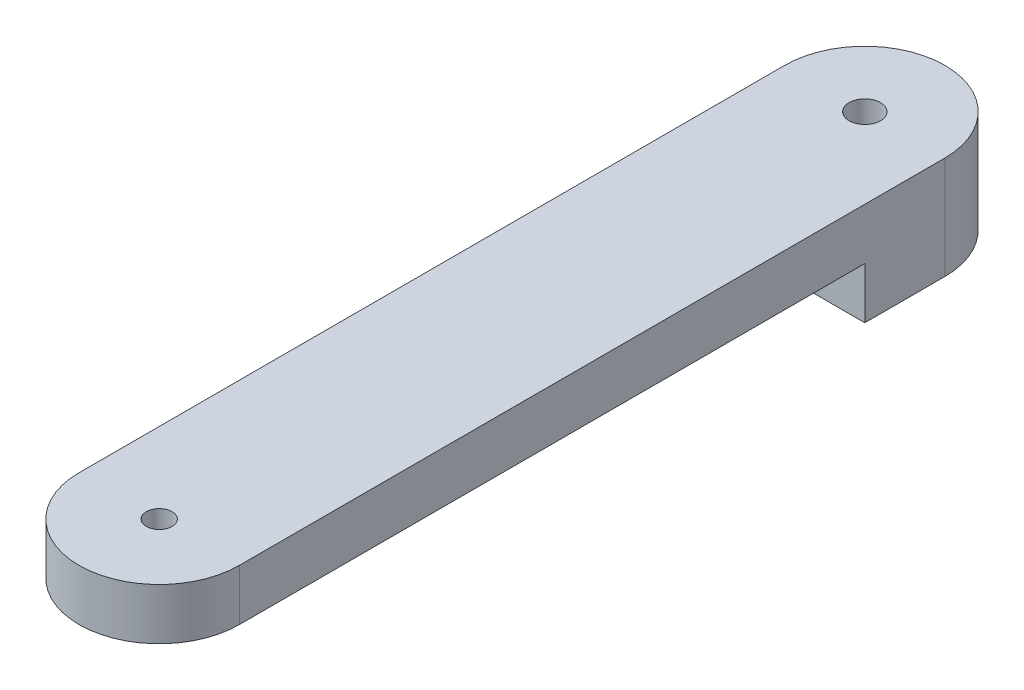
ISO-10303-21;
HEADER;
FILE_DESCRIPTION(('STEP AP214'),'2;1');
FILE_NAME('part.step','',(''),(''),'','','');
FILE_SCHEMA(('AUTOMOTIVE_DESIGN { 1 0 10303 214 1 1 1 1 }'));
ENDSEC;
DATA;
#1=APPLICATION_CONTEXT('core data for automotive mechanical design processes');
#2=APPLICATION_PROTOCOL_DEFINITION('international standard','automotive_design',2000,#1);
#3=PRODUCT_CONTEXT('',#1,'mechanical');
#4=PRODUCT('Part','Part','',(#3));
#5=PRODUCT_RELATED_PRODUCT_CATEGORY('part','',(#4));
#6=PRODUCT_DEFINITION_FORMATION('','',#4);
#7=PRODUCT_DEFINITION_CONTEXT('part definition',#1,'design');
#8=PRODUCT_DEFINITION('design','',#6,#7);
#9=PRODUCT_DEFINITION_SHAPE('','',#8);
#10=(LENGTH_UNIT() NAMED_UNIT(*) SI_UNIT(.MILLI.,.METRE.));
#11=(NAMED_UNIT(*) PLANE_ANGLE_UNIT() SI_UNIT($,.RADIAN.));
#12=(NAMED_UNIT(*) SI_UNIT($,.STERADIAN.) SOLID_ANGLE_UNIT());
#13=UNCERTAINTY_MEASURE_WITH_UNIT(LENGTH_MEASURE(1.E-05),#10,'distance_accuracy_value','');
#14=(GEOMETRIC_REPRESENTATION_CONTEXT(3) GLOBAL_UNCERTAINTY_ASSIGNED_CONTEXT((#13)) GLOBAL_UNIT_ASSIGNED_CONTEXT((#10,
#11,#12)) REPRESENTATION_CONTEXT('',''));
#15=CARTESIAN_POINT('',(0.,0.,0.));
#16=DIRECTION('',(0.,0.,1.));
#17=DIRECTION('',(1.,0.,0.));
#18=AXIS2_PLACEMENT_3D('',#15,#16,#17);
#19=CARTESIAN_POINT('',(0.,0.,0.));
#20=DIRECTION('',(0.,1.,0.));
#21=DIRECTION('',(0.,0.,1.));
#22=AXIS2_PLACEMENT_3D('',#19,#20,#21);
#23=PLANE('',#22);
#24=CARTESIAN_POINT('',(0.,0.,0.));
#25=DIRECTION('',(0.,1.,0.));
#26=DIRECTION('',(0.,0.,1.));
#27=AXIS2_PLACEMENT_3D('',#24,#25,#26);
#28=CIRCLE('',#27,2.);
#29=CARTESIAN_POINT('',(0.,0.,2.));
#30=VERTEX_POINT('',#29);
#31=EDGE_CURVE('E131',#30,#30,#28,.T.);
#32=ORIENTED_EDGE('',*,*,#31,.T.);
#33=EDGE_LOOP('',(#32));
#34=FACE_BOUND('',#33,.T.);
#35=DIRECTION('',(-1.,0.,0.));
#36=VECTOR('',#35,1.);
#37=CARTESIAN_POINT('',(-12.5,0.,-97.5));
#38=LINE('',#37,#36);
#39=CARTESIAN_POINT('',(12.5,0.,-97.5));
#40=VERTEX_POINT('',#39);
#41=CARTESIAN_POINT('',(-12.5,0.,-97.5));
#42=VERTEX_POINT('',#41);
#43=EDGE_CURVE('E58',#40,#42,#38,.T.);
#44=ORIENTED_EDGE('',*,*,#43,.F.);
#45=DIRECTION('',(0.,0.,1.));
#46=VECTOR('',#45,1.);
#47=CARTESIAN_POINT('',(12.5,0.,0.));
#48=LINE('',#47,#46);
#49=CARTESIAN_POINT('',(12.5,0.,0.));
#50=VERTEX_POINT('',#49);
#51=EDGE_CURVE('E82',#40,#50,#48,.T.);
#52=ORIENTED_EDGE('',*,*,#51,.T.);
#53=CARTESIAN_POINT('',(0.,0.,0.));
#54=DIRECTION('',(0.,1.,0.));
#55=DIRECTION('',(0.,0.,1.));
#56=AXIS2_PLACEMENT_3D('',#53,#54,#55);
#57=CIRCLE('',#56,12.5);
#58=CARTESIAN_POINT('',(-12.5,0.,0.));
#59=VERTEX_POINT('',#58);
#60=EDGE_CURVE('E284',#59,#50,#57,.T.);
#61=ORIENTED_EDGE('',*,*,#60,.F.);
#62=DIRECTION('',(0.,0.,1.));
#63=VECTOR('',#62,1.);
#64=CARTESIAN_POINT('',(-12.5,0.,0.));
#65=LINE('',#64,#63);
#66=EDGE_CURVE('E262',#42,#59,#65,.T.);
#67=ORIENTED_EDGE('',*,*,#66,.F.);
#68=EDGE_LOOP('',(#44,#52,#61,#67));
#69=FACE_BOUND('',#68,.T.);
#70=ADVANCED_FACE('F41',(#34,#69),#23,.F.);
#71=CARTESIAN_POINT('',(12.5,8.,0.));
#72=DIRECTION('',(1.,0.,0.));
#73=DIRECTION('',(0.,0.,-1.));
#74=AXIS2_PLACEMENT_3D('',#71,#72,#73);
#75=PLANE('',#74);
#76=ORIENTED_EDGE('',*,*,#51,.F.);
#77=DIRECTION('',(0.,1.,0.));
#78=VECTOR('',#77,1.);
#79=CARTESIAN_POINT('',(12.5,-8.,-97.5));
#80=LINE('',#79,#78);
#81=CARTESIAN_POINT('',(12.5,-8.,-97.5));
#82=VERTEX_POINT('',#81);
#83=EDGE_CURVE('E115',#82,#40,#80,.T.);
#84=ORIENTED_EDGE('',*,*,#83,.F.);
#85=DIRECTION('',(0.,0.,1.));
#86=VECTOR('',#85,1.);
#87=CARTESIAN_POINT('',(12.5,-8.,-110.));
#88=LINE('',#87,#86);
#89=CARTESIAN_POINT('',(12.5,-8.,-110.));
#90=VERTEX_POINT('',#89);
#91=EDGE_CURVE('E109',#90,#82,#88,.T.);
#92=ORIENTED_EDGE('',*,*,#91,.F.);
#93=DIRECTION('',(0.,-1.,0.));
#94=VECTOR('',#93,1.);
#95=CARTESIAN_POINT('',(12.5,8.,-110.));
#96=LINE('',#95,#94);
#97=CARTESIAN_POINT('',(12.5,8.,-110.));
#98=VERTEX_POINT('',#97);
#99=EDGE_CURVE('E11',#98,#90,#96,.T.);
#100=ORIENTED_EDGE('',*,*,#99,.F.);
#101=DIRECTION('',(0.,0.,1.));
#102=VECTOR('',#101,1.);
#103=CARTESIAN_POINT('',(12.5,8.,0.));
#104=LINE('',#103,#102);
#105=CARTESIAN_POINT('',(12.5,8.,0.));
#106=VERTEX_POINT('',#105);
#107=EDGE_CURVE('E144',#98,#106,#104,.T.);
#108=ORIENTED_EDGE('',*,*,#107,.T.);
#109=DIRECTION('',(0.,-1.,0.));
#110=VECTOR('',#109,1.);
#111=CARTESIAN_POINT('',(12.5,8.,0.));
#112=LINE('',#111,#110);
#113=EDGE_CURVE('E272',#106,#50,#112,.T.);
#114=ORIENTED_EDGE('',*,*,#113,.T.);
#115=EDGE_LOOP('',(#76,#84,#92,#100,#108,#114));
#116=FACE_BOUND('',#115,.T.);
#117=ADVANCED_FACE('F43',(#116),#75,.T.);
#118=CARTESIAN_POINT('',(0.,8.,-110.));
#119=DIRECTION('',(0.,-1.,0.));
#120=DIRECTION('',(0.,0.,-1.));
#121=AXIS2_PLACEMENT_3D('',#118,#119,#120);
#122=CYLINDRICAL_SURFACE('',#121,12.5);
#123=ORIENTED_EDGE('',*,*,#99,.T.);
#124=CARTESIAN_POINT('',(0.,-8.,-110.));
#125=DIRECTION('',(0.,-1.,0.));
#126=DIRECTION('',(0.,0.,-1.));
#127=AXIS2_PLACEMENT_3D('',#124,#125,#126);
#128=CIRCLE('',#127,12.5);
#129=CARTESIAN_POINT('',(-12.5,-8.,-110.));
#130=VERTEX_POINT('',#129);
#131=EDGE_CURVE('E110',#130,#90,#128,.T.);
#132=ORIENTED_EDGE('',*,*,#131,.F.);
#133=DIRECTION('',(0.,-1.,0.));
#134=VECTOR('',#133,1.);
#135=CARTESIAN_POINT('',(-12.5,8.,-110.));
#136=LINE('',#135,#134);
#137=CARTESIAN_POINT('',(-12.5,8.,-110.));
#138=VERTEX_POINT('',#137);
#139=EDGE_CURVE('E55',#138,#130,#136,.T.);
#140=ORIENTED_EDGE('',*,*,#139,.F.);
#141=CARTESIAN_POINT('',(0.,8.,-110.));
#142=DIRECTION('',(0.,1.,0.));
#143=DIRECTION('',(0.,0.,1.));
#144=AXIS2_PLACEMENT_3D('',#141,#142,#143);
#145=CIRCLE('',#144,12.5);
#146=EDGE_CURVE('E108',#98,#138,#145,.T.);
#147=ORIENTED_EDGE('',*,*,#146,.F.);
#148=EDGE_LOOP('',(#123,#132,#140,#147));
#149=FACE_BOUND('',#148,.T.);
#150=ADVANCED_FACE('F104',(#149),#122,.T.);
#151=CARTESIAN_POINT('',(-12.5,8.,0.));
#152=DIRECTION('',(1.,0.,0.));
#153=DIRECTION('',(0.,0.,-1.));
#154=AXIS2_PLACEMENT_3D('',#151,#152,#153);
#155=PLANE('',#154);
#156=ORIENTED_EDGE('',*,*,#139,.T.);
#157=DIRECTION('',(0.,0.,-1.));
#158=VECTOR('',#157,1.);
#159=CARTESIAN_POINT('',(-12.5,-8.,-110.));
#160=LINE('',#159,#158);
#161=CARTESIAN_POINT('',(-12.5,-8.,-97.5));
#162=VERTEX_POINT('',#161);
#163=EDGE_CURVE('E119',#162,#130,#160,.T.);
#164=ORIENTED_EDGE('',*,*,#163,.F.);
#165=DIRECTION('',(0.,1.,0.));
#166=VECTOR('',#165,1.);
#167=CARTESIAN_POINT('',(-12.5,-8.,-97.5));
#168=LINE('',#167,#166);
#169=EDGE_CURVE('E130',#162,#42,#168,.T.);
#170=ORIENTED_EDGE('',*,*,#169,.T.);
#171=ORIENTED_EDGE('',*,*,#66,.T.);
#172=DIRECTION('',(0.,-1.,0.));
#173=VECTOR('',#172,1.);
#174=CARTESIAN_POINT('',(-12.5,8.,0.));
#175=LINE('',#174,#173);
#176=CARTESIAN_POINT('',(-12.5,8.,0.));
#177=VERTEX_POINT('',#176);
#178=EDGE_CURVE('E266',#177,#59,#175,.T.);
#179=ORIENTED_EDGE('',*,*,#178,.F.);
#180=DIRECTION('',(0.,0.,1.));
#181=VECTOR('',#180,1.);
#182=CARTESIAN_POINT('',(-12.5,8.,0.));
#183=LINE('',#182,#181);
#184=EDGE_CURVE('E270',#138,#177,#183,.T.);
#185=ORIENTED_EDGE('',*,*,#184,.F.);
#186=EDGE_LOOP('',(#156,#164,#170,#171,#179,#185));
#187=FACE_BOUND('',#186,.T.);
#188=ADVANCED_FACE('F173',(#187),#155,.F.);
#189=CARTESIAN_POINT('',(0.,8.,0.));
#190=DIRECTION('',(0.,-1.,0.));
#191=DIRECTION('',(0.,0.,-1.));
#192=AXIS2_PLACEMENT_3D('',#189,#190,#191);
#193=CYLINDRICAL_SURFACE('',#192,12.5);
#194=ORIENTED_EDGE('',*,*,#60,.T.);
#195=ORIENTED_EDGE('',*,*,#113,.F.);
#196=CARTESIAN_POINT('',(0.,8.,0.));
#197=DIRECTION('',(0.,1.,0.));
#198=DIRECTION('',(0.,0.,1.));
#199=AXIS2_PLACEMENT_3D('',#196,#197,#198);
#200=CIRCLE('',#199,12.5);
#201=EDGE_CURVE('E69',#177,#106,#200,.T.);
#202=ORIENTED_EDGE('',*,*,#201,.F.);
#203=ORIENTED_EDGE('',*,*,#178,.T.);
#204=EDGE_LOOP('',(#194,#195,#202,#203));
#205=FACE_BOUND('',#204,.T.);
#206=ADVANCED_FACE('F169',(#205),#193,.T.);
#207=CARTESIAN_POINT('',(0.,8.,-110.));
#208=DIRECTION('',(0.,-1.,0.));
#209=DIRECTION('',(0.,0.,-1.));
#210=AXIS2_PLACEMENT_3D('',#207,#208,#209);
#211=CYLINDRICAL_SURFACE('',#210,2.45);
#212=CARTESIAN_POINT('',(0.,8.,-110.));
#213=DIRECTION('',(0.,1.,0.));
#214=DIRECTION('',(0.,0.,1.));
#215=AXIS2_PLACEMENT_3D('',#212,#213,#214);
#216=CIRCLE('',#215,2.45);
#217=CARTESIAN_POINT('',(0.,8.,-107.55));
#218=VERTEX_POINT('',#217);
#219=EDGE_CURVE('E280',#218,#218,#216,.T.);
#220=ORIENTED_EDGE('',*,*,#219,.T.);
#221=EDGE_LOOP('',(#220));
#222=FACE_BOUND('',#221,.T.);
#223=CARTESIAN_POINT('',(0.,-8.,-110.));
#224=DIRECTION('',(0.,1.,0.));
#225=DIRECTION('',(0.,0.,1.));
#226=AXIS2_PLACEMENT_3D('',#223,#224,#225);
#227=CIRCLE('',#226,2.44999999999999);
#228=CARTESIAN_POINT('',(0.,-8.,-107.55));
#229=VERTEX_POINT('',#228);
#230=EDGE_CURVE('E125',#229,#229,#227,.T.);
#231=ORIENTED_EDGE('',*,*,#230,.F.);
#232=EDGE_LOOP('',(#231));
#233=FACE_BOUND('',#232,.T.);
#234=ADVANCED_FACE('F162',(#222,#233),#211,.F.);
#235=CARTESIAN_POINT('',(0.,8.,0.));
#236=DIRECTION('',(0.,1.,0.));
#237=DIRECTION('',(0.,0.,1.));
#238=AXIS2_PLACEMENT_3D('',#235,#236,#237);
#239=PLANE('',#238);
#240=CARTESIAN_POINT('',(0.,8.000012,0.));
#241=DIRECTION('',(0.,1.,0.));
#242=DIRECTION('',(0.,0.,1.));
#243=AXIS2_PLACEMENT_3D('',#240,#241,#242);
#244=CIRCLE('',#243,2.);
#245=CARTESIAN_POINT('',(0.,8.000012,2.));
#246=VERTEX_POINT('',#245);
#247=EDGE_CURVE('E135',#246,#246,#244,.T.);
#248=ORIENTED_EDGE('',*,*,#247,.F.);
#249=EDGE_LOOP('',(#248));
#250=FACE_BOUND('',#249,.T.);
#251=ORIENTED_EDGE('',*,*,#107,.F.);
#252=ORIENTED_EDGE('',*,*,#146,.T.);
#253=ORIENTED_EDGE('',*,*,#184,.T.);
#254=ORIENTED_EDGE('',*,*,#201,.T.);
#255=EDGE_LOOP('',(#251,#252,#253,#254));
#256=FACE_BOUND('',#255,.T.);
#257=ORIENTED_EDGE('',*,*,#219,.F.);
#258=EDGE_LOOP('',(#257));
#259=FACE_BOUND('',#258,.T.);
#260=ADVANCED_FACE('F152',(#250,#256,#259),#239,.T.);
#261=CARTESIAN_POINT('',(0.,0.,0.));
#262=DIRECTION('',(0.,1.,0.));
#263=DIRECTION('',(0.,0.,1.));
#264=AXIS2_PLACEMENT_3D('',#261,#262,#263);
#265=CYLINDRICAL_SURFACE('',#264,2.);
#266=ORIENTED_EDGE('',*,*,#31,.F.);
#267=EDGE_LOOP('',(#266));
#268=FACE_BOUND('',#267,.T.);
#269=ORIENTED_EDGE('',*,*,#247,.T.);
#270=EDGE_LOOP('',(#269));
#271=FACE_BOUND('',#270,.T.);
#272=ADVANCED_FACE('F147',(#268,#271),#265,.F.);
#273=CARTESIAN_POINT('',(0.,-8.,-110.));
#274=DIRECTION('',(0.,-1.,0.));
#275=DIRECTION('',(0.,0.,-1.));
#276=AXIS2_PLACEMENT_3D('',#273,#274,#275);
#277=PLANE('',#276);
#278=ORIENTED_EDGE('',*,*,#230,.T.);
#279=EDGE_LOOP('',(#278));
#280=FACE_BOUND('',#279,.T.);
#281=ORIENTED_EDGE('',*,*,#131,.T.);
#282=ORIENTED_EDGE('',*,*,#91,.T.);
#283=DIRECTION('',(-1.,0.,0.));
#284=VECTOR('',#283,1.);
#285=CARTESIAN_POINT('',(-12.5,-8.,-97.5));
#286=LINE('',#285,#284);
#287=EDGE_CURVE('E114',#82,#162,#286,.T.);
#288=ORIENTED_EDGE('',*,*,#287,.T.);
#289=ORIENTED_EDGE('',*,*,#163,.T.);
#290=EDGE_LOOP('',(#281,#282,#288,#289));
#291=FACE_BOUND('',#290,.T.);
#292=ADVANCED_FACE('F117',(#280,#291),#277,.T.);
#293=CARTESIAN_POINT('',(-12.5,-8.,-97.5));
#294=DIRECTION('',(0.,0.,-1.));
#295=DIRECTION('',(-1.,0.,0.));
#296=AXIS2_PLACEMENT_3D('',#293,#294,#295);
#297=PLANE('',#296);
#298=ORIENTED_EDGE('',*,*,#43,.T.);
#299=ORIENTED_EDGE('',*,*,#169,.F.);
#300=ORIENTED_EDGE('',*,*,#287,.F.);
#301=ORIENTED_EDGE('',*,*,#83,.T.);
#302=EDGE_LOOP('',(#298,#299,#300,#301));
#303=FACE_BOUND('',#302,.T.);
#304=ADVANCED_FACE('F159',(#303),#297,.F.);
#305=CLOSED_SHELL('',(#70,#117,#150,#188,#206,#234,#260,#272,#292,#304));
#306=MANIFOLD_SOLID_BREP('B2',#305);
#307=ADVANCED_BREP_SHAPE_REPRESENTATION('',(#18,#306),#14);
#308=SHAPE_DEFINITION_REPRESENTATION(#9,#307);
ENDSEC;
END-ISO-10303-21;
